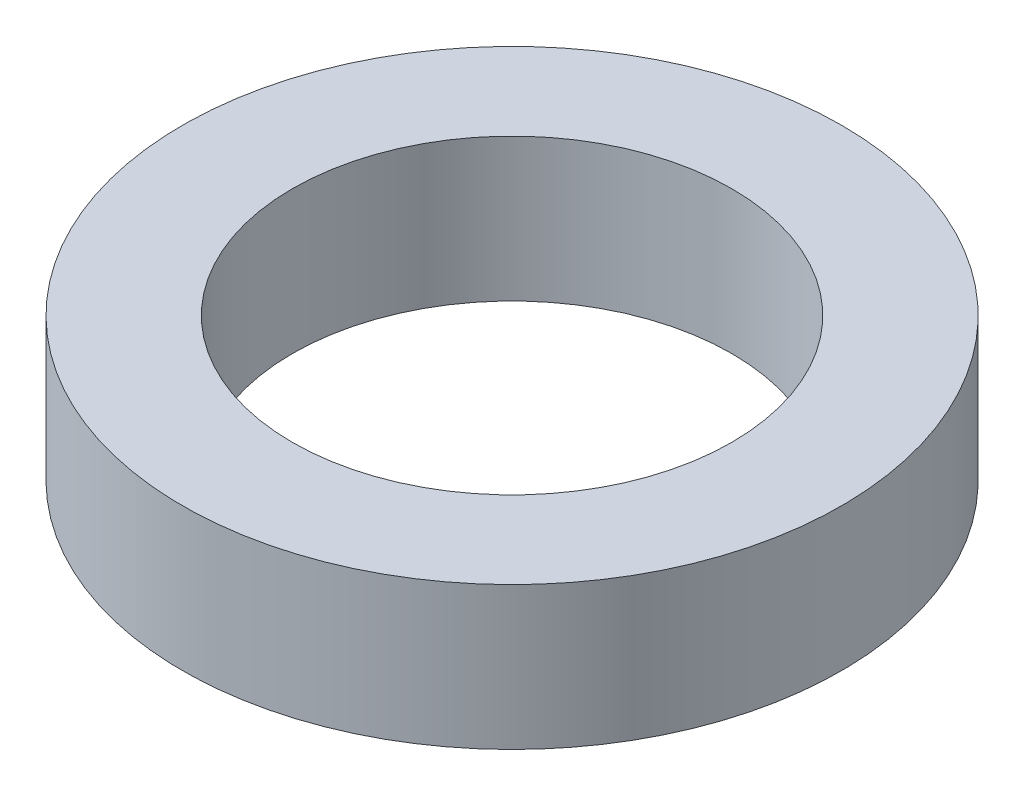
ISO-10303-21;
HEADER;
FILE_DESCRIPTION(('STEP AP214'),'2;1');
FILE_NAME('part.step','',(''),(''),'','','');
FILE_SCHEMA(('AUTOMOTIVE_DESIGN { 1 0 10303 214 1 1 1 1 }'));
ENDSEC;
DATA;
#1=APPLICATION_CONTEXT('core data for automotive mechanical design processes');
#2=APPLICATION_PROTOCOL_DEFINITION('international standard','automotive_design',2000,#1);
#3=PRODUCT_CONTEXT('',#1,'mechanical');
#4=PRODUCT('Part','Part','',(#3));
#5=PRODUCT_RELATED_PRODUCT_CATEGORY('part','',(#4));
#6=PRODUCT_DEFINITION_FORMATION('','',#4);
#7=PRODUCT_DEFINITION_CONTEXT('part definition',#1,'design');
#8=PRODUCT_DEFINITION('design','',#6,#7);
#9=PRODUCT_DEFINITION_SHAPE('','',#8);
#10=(LENGTH_UNIT() NAMED_UNIT(*) SI_UNIT(.MILLI.,.METRE.));
#11=(NAMED_UNIT(*) PLANE_ANGLE_UNIT() SI_UNIT($,.RADIAN.));
#12=(NAMED_UNIT(*) SI_UNIT($,.STERADIAN.) SOLID_ANGLE_UNIT());
#13=UNCERTAINTY_MEASURE_WITH_UNIT(LENGTH_MEASURE(1.E-05),#10,'distance_accuracy_value','');
#14=(GEOMETRIC_REPRESENTATION_CONTEXT(3) GLOBAL_UNCERTAINTY_ASSIGNED_CONTEXT((#13)) GLOBAL_UNIT_ASSIGNED_CONTEXT((#10,
#11,#12)) REPRESENTATION_CONTEXT('',''));
#15=CARTESIAN_POINT('',(0.,0.,0.));
#16=DIRECTION('',(0.,0.,1.));
#17=DIRECTION('',(1.,0.,0.));
#18=AXIS2_PLACEMENT_3D('',#15,#16,#17);
#19=CARTESIAN_POINT('',(0.,13.,0.));
#20=DIRECTION('',(0.,1.,0.));
#21=DIRECTION('',(0.,0.,1.));
#22=AXIS2_PLACEMENT_3D('',#19,#20,#21);
#23=PLANE('',#22);
#24=CARTESIAN_POINT('',(0.,13.,0.));
#25=DIRECTION('',(0.,1.,0.));
#26=DIRECTION('',(0.,0.,1.));
#27=AXIS2_PLACEMENT_3D('',#24,#25,#26);
#28=CIRCLE('',#27,30.);
#29=CARTESIAN_POINT('',(0.,13.,-30.));
#30=VERTEX_POINT('',#29);
#31=EDGE_CURVE('E10',#30,#30,#28,.T.);
#32=ORIENTED_EDGE('',*,*,#31,.T.);
#33=EDGE_LOOP('',(#32));
#34=FACE_BOUND('',#33,.T.);
#35=CARTESIAN_POINT('',(0.,13.,0.));
#36=DIRECTION('',(0.,1.,0.));
#37=DIRECTION('',(0.,0.,1.));
#38=AXIS2_PLACEMENT_3D('',#35,#36,#37);
#39=CIRCLE('',#38,20.);
#40=CARTESIAN_POINT('',(0.,13.,-20.));
#41=VERTEX_POINT('',#40);
#42=EDGE_CURVE('E49',#41,#41,#39,.T.);
#43=ORIENTED_EDGE('',*,*,#42,.F.);
#44=EDGE_LOOP('',(#43));
#45=FACE_BOUND('',#44,.T.);
#46=ADVANCED_FACE('F38',(#34,#45),#23,.T.);
#47=CARTESIAN_POINT('',(0.,0.,0.));
#48=DIRECTION('',(0.,1.,0.));
#49=DIRECTION('',(0.,0.,1.));
#50=AXIS2_PLACEMENT_3D('',#47,#48,#49);
#51=PLANE('',#50);
#52=CARTESIAN_POINT('',(0.,0.,0.));
#53=DIRECTION('',(0.,1.,0.));
#54=DIRECTION('',(0.,0.,1.));
#55=AXIS2_PLACEMENT_3D('',#52,#53,#54);
#56=CIRCLE('',#55,30.);
#57=CARTESIAN_POINT('',(0.,0.,-30.));
#58=VERTEX_POINT('',#57);
#59=EDGE_CURVE('E42',#58,#58,#56,.T.);
#60=ORIENTED_EDGE('',*,*,#59,.F.);
#61=EDGE_LOOP('',(#60));
#62=FACE_BOUND('',#61,.T.);
#63=CARTESIAN_POINT('',(0.,0.,0.));
#64=DIRECTION('',(0.,1.,0.));
#65=DIRECTION('',(0.,0.,1.));
#66=AXIS2_PLACEMENT_3D('',#63,#64,#65);
#67=CIRCLE('',#66,20.);
#68=CARTESIAN_POINT('',(0.,0.,-20.));
#69=VERTEX_POINT('',#68);
#70=EDGE_CURVE('E51',#69,#69,#67,.T.);
#71=ORIENTED_EDGE('',*,*,#70,.T.);
#72=EDGE_LOOP('',(#71));
#73=FACE_BOUND('',#72,.T.);
#74=ADVANCED_FACE('F61',(#62,#73),#51,.F.);
#75=CARTESIAN_POINT('',(0.,13.,0.));
#76=DIRECTION('',(0.,-1.,0.));
#77=DIRECTION('',(0.,0.,-1.));
#78=AXIS2_PLACEMENT_3D('',#75,#76,#77);
#79=CYLINDRICAL_SURFACE('',#78,30.);
#80=CARTESIAN_POINT('',(0.,13.,-30.));
#81=CARTESIAN_POINT('',(0.,12.8645833333333,-30.));
#82=CARTESIAN_POINT('',(0.,12.7291666666667,-30.));
#83=CARTESIAN_POINT('',(0.,12.4583333333333,-30.));
#84=CARTESIAN_POINT('',(0.,12.3229166666667,-30.));
#85=CARTESIAN_POINT('',(0.,12.0520833333333,-30.));
#86=CARTESIAN_POINT('',(0.,11.9166666666667,-30.));
#87=CARTESIAN_POINT('',(0.,11.6458333333333,-30.));
#88=CARTESIAN_POINT('',(0.,11.5104166666667,-30.));
#89=CARTESIAN_POINT('',(0.,11.2395833333333,-30.));
#90=CARTESIAN_POINT('',(0.,11.1041666666667,-30.));
#91=CARTESIAN_POINT('',(0.,10.8333333333333,-30.));
#92=CARTESIAN_POINT('',(0.,10.6979166666667,-30.));
#93=CARTESIAN_POINT('',(0.,10.4270833333333,-30.));
#94=CARTESIAN_POINT('',(0.,10.2916666666667,-30.));
#95=CARTESIAN_POINT('',(0.,10.0208333333333,-30.));
#96=CARTESIAN_POINT('',(0.,9.88541666666667,-30.));
#97=CARTESIAN_POINT('',(0.,9.61458333333333,-30.));
#98=CARTESIAN_POINT('',(0.,9.47916666666667,-30.));
#99=CARTESIAN_POINT('',(0.,9.20833333333333,-30.));
#100=CARTESIAN_POINT('',(0.,9.07291666666667,-30.));
#101=CARTESIAN_POINT('',(0.,8.80208333333333,-30.));
#102=CARTESIAN_POINT('',(0.,8.66666666666667,-30.));
#103=CARTESIAN_POINT('',(0.,8.39583333333333,-30.));
#104=CARTESIAN_POINT('',(0.,8.26041666666667,-30.));
#105=CARTESIAN_POINT('',(0.,7.98958333333333,-30.));
#106=CARTESIAN_POINT('',(0.,7.85416666666667,-30.));
#107=CARTESIAN_POINT('',(0.,7.58333333333333,-30.));
#108=CARTESIAN_POINT('',(0.,7.44791666666667,-30.));
#109=CARTESIAN_POINT('',(0.,7.17708333333333,-30.));
#110=CARTESIAN_POINT('',(0.,7.04166666666667,-30.));
#111=CARTESIAN_POINT('',(0.,6.77083333333333,-30.));
#112=CARTESIAN_POINT('',(0.,6.63541666666667,-30.));
#113=CARTESIAN_POINT('',(0.,6.36458333333333,-30.));
#114=CARTESIAN_POINT('',(0.,6.22916666666667,-30.));
#115=CARTESIAN_POINT('',(0.,5.95833333333333,-30.));
#116=CARTESIAN_POINT('',(0.,5.82291666666667,-30.));
#117=CARTESIAN_POINT('',(0.,5.55208333333333,-30.));
#118=CARTESIAN_POINT('',(0.,5.41666666666667,-30.));
#119=CARTESIAN_POINT('',(0.,5.14583333333333,-30.));
#120=CARTESIAN_POINT('',(0.,5.01041666666667,-30.));
#121=CARTESIAN_POINT('',(0.,4.73958333333333,-30.));
#122=CARTESIAN_POINT('',(0.,4.60416666666667,-30.));
#123=CARTESIAN_POINT('',(0.,4.33333333333333,-30.));
#124=CARTESIAN_POINT('',(0.,4.19791666666667,-30.));
#125=CARTESIAN_POINT('',(0.,3.92708333333333,-30.));
#126=CARTESIAN_POINT('',(0.,3.79166666666667,-30.));
#127=CARTESIAN_POINT('',(0.,3.52083333333333,-30.));
#128=CARTESIAN_POINT('',(0.,3.38541666666667,-30.));
#129=CARTESIAN_POINT('',(0.,3.11458333333333,-30.));
#130=CARTESIAN_POINT('',(0.,2.97916666666667,-30.));
#131=CARTESIAN_POINT('',(0.,2.70833333333333,-30.));
#132=CARTESIAN_POINT('',(0.,2.57291666666667,-30.));
#133=CARTESIAN_POINT('',(0.,2.30208333333333,-30.));
#134=CARTESIAN_POINT('',(0.,2.16666666666667,-30.));
#135=CARTESIAN_POINT('',(0.,1.89583333333333,-30.));
#136=CARTESIAN_POINT('',(0.,1.76041666666667,-30.));
#137=CARTESIAN_POINT('',(0.,1.48958333333333,-30.));
#138=CARTESIAN_POINT('',(0.,1.35416666666667,-30.));
#139=CARTESIAN_POINT('',(0.,1.08333333333333,-30.));
#140=CARTESIAN_POINT('',(0.,0.947916666666667,-30.));
#141=CARTESIAN_POINT('',(0.,0.677083333333334,-30.));
#142=CARTESIAN_POINT('',(0.,0.541666666666667,-30.));
#143=CARTESIAN_POINT('',(0.,0.270833333333334,-30.));
#144=CARTESIAN_POINT('',(0.,0.135416666666667,-30.));
#145=CARTESIAN_POINT('',(0.,0.,-30.));
#146=B_SPLINE_CURVE_WITH_KNOTS('',3,(#80,#81,#82,#83,#84,#85,#86,#87,#88,#89,#90,#91,#92,#93,
#94,#95,#96,#97,#98,#99,#100,#101,#102,#103,#104,#105,#106,#107,#108,#109,#110,#111,#112,#113,
#114,#115,#116,#117,#118,#119,#120,#121,#122,#123,#124,#125,#126,#127,#128,#129,#130,#131,#132,
#133,#134,#135,#136,#137,#138,#139,#140,#141,#142,#143,#144,#145),.UNSPECIFIED.,.F.,.F.,(4,2,2,
2,2,2,2,2,2,2,2,2,2,2,2,2,2,2,2,2,2,2,2,2,2,2,2,2,2,2,2,2,4),(0.,0.406249999999999,
0.812499999999999,1.21875,1.625,2.03125,2.4375,2.84375,3.25,3.65625,4.0625,4.46875,4.875,
5.28125,5.6875,6.09375,6.5,6.90625,7.3125,7.71875,8.125,8.53125,8.9375,9.34375,9.75,10.15625,
10.5625,10.96875,11.375,11.78125,12.1875,12.59375,13.),.UNSPECIFIED.);
#147=EDGE_CURVE('BSEAM40',#30,#58,#146,.T.);
#148=ORIENTED_EDGE('',*,*,#31,.F.);
#149=ORIENTED_EDGE('',*,*,#59,.T.);
#150=ORIENTED_EDGE('',*,*,#147,.T.);
#151=ORIENTED_EDGE('',*,*,#147,.F.);
#152=EDGE_LOOP('',(#148,#150,#149,#151));
#153=FACE_BOUND('',#152,.T.);
#154=ADVANCED_FACE('F40',(#153),#79,.T.);
#155=CARTESIAN_POINT('',(0.,13.,0.));
#156=DIRECTION('',(0.,-1.,0.));
#157=DIRECTION('',(0.,0.,-1.));
#158=AXIS2_PLACEMENT_3D('',#155,#156,#157);
#159=CYLINDRICAL_SURFACE('',#158,20.);
#160=CARTESIAN_POINT('',(0.,13.,-20.));
#161=CARTESIAN_POINT('',(0.,12.8645833333333,-20.));
#162=CARTESIAN_POINT('',(0.,12.7291666666667,-20.));
#163=CARTESIAN_POINT('',(0.,12.4583333333333,-20.));
#164=CARTESIAN_POINT('',(0.,12.3229166666667,-20.));
#165=CARTESIAN_POINT('',(0.,12.0520833333333,-20.));
#166=CARTESIAN_POINT('',(0.,11.9166666666667,-20.));
#167=CARTESIAN_POINT('',(0.,11.6458333333333,-20.));
#168=CARTESIAN_POINT('',(0.,11.5104166666667,-20.));
#169=CARTESIAN_POINT('',(0.,11.2395833333333,-20.));
#170=CARTESIAN_POINT('',(0.,11.1041666666667,-20.));
#171=CARTESIAN_POINT('',(0.,10.8333333333333,-20.));
#172=CARTESIAN_POINT('',(0.,10.6979166666667,-20.));
#173=CARTESIAN_POINT('',(0.,10.4270833333333,-20.));
#174=CARTESIAN_POINT('',(0.,10.2916666666667,-20.));
#175=CARTESIAN_POINT('',(0.,10.0208333333333,-20.));
#176=CARTESIAN_POINT('',(0.,9.88541666666667,-20.));
#177=CARTESIAN_POINT('',(0.,9.61458333333333,-20.));
#178=CARTESIAN_POINT('',(0.,9.47916666666667,-20.));
#179=CARTESIAN_POINT('',(0.,9.20833333333333,-20.));
#180=CARTESIAN_POINT('',(0.,9.07291666666666,-20.));
#181=CARTESIAN_POINT('',(0.,8.80208333333333,-20.));
#182=CARTESIAN_POINT('',(0.,8.66666666666667,-20.));
#183=CARTESIAN_POINT('',(0.,8.39583333333333,-20.));
#184=CARTESIAN_POINT('',(0.,8.26041666666667,-20.));
#185=CARTESIAN_POINT('',(0.,7.98958333333333,-20.));
#186=CARTESIAN_POINT('',(0.,7.85416666666667,-20.));
#187=CARTESIAN_POINT('',(0.,7.58333333333333,-20.));
#188=CARTESIAN_POINT('',(0.,7.44791666666667,-20.));
#189=CARTESIAN_POINT('',(0.,7.17708333333333,-20.));
#190=CARTESIAN_POINT('',(0.,7.04166666666667,-20.));
#191=CARTESIAN_POINT('',(0.,6.77083333333333,-20.));
#192=CARTESIAN_POINT('',(0.,6.63541666666667,-20.));
#193=CARTESIAN_POINT('',(0.,6.36458333333333,-20.));
#194=CARTESIAN_POINT('',(0.,6.22916666666667,-20.));
#195=CARTESIAN_POINT('',(0.,5.95833333333333,-20.));
#196=CARTESIAN_POINT('',(0.,5.82291666666667,-20.));
#197=CARTESIAN_POINT('',(0.,5.55208333333333,-20.));
#198=CARTESIAN_POINT('',(0.,5.41666666666667,-20.));
#199=CARTESIAN_POINT('',(0.,5.14583333333333,-20.));
#200=CARTESIAN_POINT('',(0.,5.01041666666667,-20.));
#201=CARTESIAN_POINT('',(0.,4.73958333333333,-20.));
#202=CARTESIAN_POINT('',(0.,4.60416666666667,-20.));
#203=CARTESIAN_POINT('',(0.,4.33333333333333,-20.));
#204=CARTESIAN_POINT('',(0.,4.19791666666667,-20.));
#205=CARTESIAN_POINT('',(0.,3.92708333333333,-20.));
#206=CARTESIAN_POINT('',(0.,3.79166666666667,-20.));
#207=CARTESIAN_POINT('',(0.,3.52083333333333,-20.));
#208=CARTESIAN_POINT('',(0.,3.38541666666667,-20.));
#209=CARTESIAN_POINT('',(0.,3.11458333333333,-20.));
#210=CARTESIAN_POINT('',(0.,2.97916666666667,-20.));
#211=CARTESIAN_POINT('',(0.,2.70833333333333,-20.));
#212=CARTESIAN_POINT('',(0.,2.57291666666667,-20.));
#213=CARTESIAN_POINT('',(0.,2.30208333333333,-20.));
#214=CARTESIAN_POINT('',(0.,2.16666666666667,-20.));
#215=CARTESIAN_POINT('',(0.,1.89583333333333,-20.));
#216=CARTESIAN_POINT('',(0.,1.76041666666667,-20.));
#217=CARTESIAN_POINT('',(0.,1.48958333333333,-20.));
#218=CARTESIAN_POINT('',(0.,1.35416666666667,-20.));
#219=CARTESIAN_POINT('',(0.,1.08333333333333,-20.));
#220=CARTESIAN_POINT('',(0.,0.947916666666667,-20.));
#221=CARTESIAN_POINT('',(0.,0.677083333333334,-20.));
#222=CARTESIAN_POINT('',(0.,0.541666666666667,-20.));
#223=CARTESIAN_POINT('',(0.,0.270833333333334,-20.));
#224=CARTESIAN_POINT('',(0.,0.135416666666667,-20.));
#225=CARTESIAN_POINT('',(0.,0.,-20.));
#226=B_SPLINE_CURVE_WITH_KNOTS('',3,(#160,#161,#162,#163,#164,#165,#166,#167,#168,#169,#170,
#171,#172,#173,#174,#175,#176,#177,#178,#179,#180,#181,#182,#183,#184,#185,#186,#187,#188,#189,
#190,#191,#192,#193,#194,#195,#196,#197,#198,#199,#200,#201,#202,#203,#204,#205,#206,#207,#208,
#209,#210,#211,#212,#213,#214,#215,#216,#217,#218,#219,#220,#221,#222,#223,#224,#225),
.UNSPECIFIED.,.F.,.F.,(4,2,2,2,2,2,2,2,2,2,2,2,2,2,2,2,2,2,2,2,2,2,2,2,2,2,2,2,2,2,2,2,4),(0.,
0.40625,0.812500000000001,1.21875,1.625,2.03125,2.4375,2.84375,3.25,3.65625,4.0625,4.46875,
4.875,5.28125,5.6875,6.09375,6.5,6.90625,7.3125,7.71875,8.125,8.53125,8.9375,9.34375,9.75,
10.15625,10.5625,10.96875,11.375,11.78125,12.1875,12.59375,13.),.UNSPECIFIED.);
#227=EDGE_CURVE('BSEAM57',#41,#69,#226,.T.);
#228=ORIENTED_EDGE('',*,*,#42,.T.);
#229=ORIENTED_EDGE('',*,*,#70,.F.);
#230=ORIENTED_EDGE('',*,*,#227,.T.);
#231=ORIENTED_EDGE('',*,*,#227,.F.);
#232=EDGE_LOOP('',(#228,#230,#229,#231));
#233=FACE_BOUND('',#232,.T.);
#234=ADVANCED_FACE('F57',(#233),#159,.F.);
#235=CLOSED_SHELL('',(#46,#74,#154,#234));
#236=MANIFOLD_SOLID_BREP('B2',#235);
#237=ADVANCED_BREP_SHAPE_REPRESENTATION('',(#18,#236),#14);
#238=SHAPE_DEFINITION_REPRESENTATION(#9,#237);
ENDSEC;
END-ISO-10303-21;
